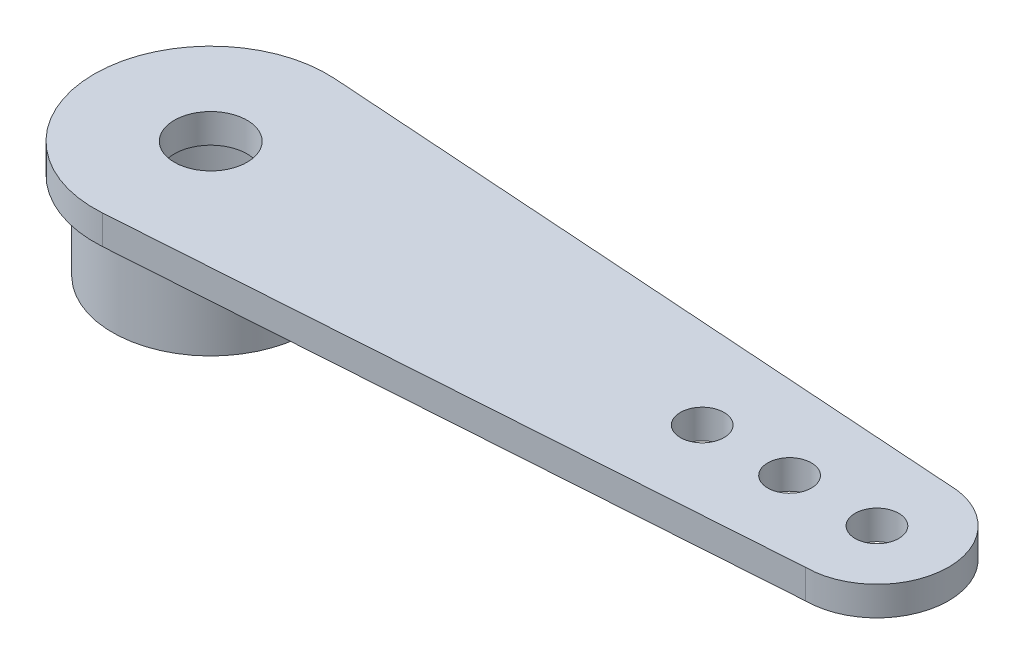
ISO-10303-21;
HEADER;
FILE_DESCRIPTION(('STEP AP214'),'2;1');
FILE_NAME('part.step','',(''),(''),'','','');
FILE_SCHEMA(('AUTOMOTIVE_DESIGN { 1 0 10303 214 1 1 1 1 }'));
ENDSEC;
DATA;
#1=APPLICATION_CONTEXT('core data for automotive mechanical design processes');
#2=APPLICATION_PROTOCOL_DEFINITION('international standard','automotive_design',2000,#1);
#3=PRODUCT_CONTEXT('',#1,'mechanical');
#4=PRODUCT('Part','Part','',(#3));
#5=PRODUCT_RELATED_PRODUCT_CATEGORY('part','',(#4));
#6=PRODUCT_DEFINITION_FORMATION('','',#4);
#7=PRODUCT_DEFINITION_CONTEXT('part definition',#1,'design');
#8=PRODUCT_DEFINITION('design','',#6,#7);
#9=PRODUCT_DEFINITION_SHAPE('','',#8);
#10=(LENGTH_UNIT() NAMED_UNIT(*) SI_UNIT(.MILLI.,.METRE.));
#11=(NAMED_UNIT(*) PLANE_ANGLE_UNIT() SI_UNIT($,.RADIAN.));
#12=(NAMED_UNIT(*) SI_UNIT($,.STERADIAN.) SOLID_ANGLE_UNIT());
#13=UNCERTAINTY_MEASURE_WITH_UNIT(LENGTH_MEASURE(1.E-05),#10,'distance_accuracy_value','');
#14=(GEOMETRIC_REPRESENTATION_CONTEXT(3) GLOBAL_UNCERTAINTY_ASSIGNED_CONTEXT((#13)) GLOBAL_UNIT_ASSIGNED_CONTEXT((#10,
#11,#12)) REPRESENTATION_CONTEXT('',''));
#15=CARTESIAN_POINT('',(0.,0.,0.));
#16=DIRECTION('',(0.,0.,1.));
#17=DIRECTION('',(1.,0.,0.));
#18=AXIS2_PLACEMENT_3D('',#15,#16,#17);
#19=CARTESIAN_POINT('',(0.,0.,0.));
#20=DIRECTION('',(0.,1.,0.));
#21=DIRECTION('',(0.,0.,1.));
#22=AXIS2_PLACEMENT_3D('',#19,#20,#21);
#23=PLANE('',#22);
#24=CARTESIAN_POINT('',(0.,0.,0.));
#25=DIRECTION('',(0.,1.,0.));
#26=DIRECTION('',(0.,0.,1.));
#27=AXIS2_PLACEMENT_3D('',#24,#25,#26);
#28=CIRCLE('',#27,3.429);
#29=CARTESIAN_POINT('',(0.,0.,-3.429));
#30=VERTEX_POINT('',#29);
#31=EDGE_CURVE('E39',#30,#30,#28,.T.);
#32=ORIENTED_EDGE('',*,*,#31,.F.);
#33=EDGE_LOOP('',(#32));
#34=FACE_BOUND('',#33,.T.);
#35=CARTESIAN_POINT('',(0.,0.,0.));
#36=DIRECTION('',(0.,1.,0.));
#37=DIRECTION('',(0.,0.,1.));
#38=AXIS2_PLACEMENT_3D('',#35,#36,#37);
#39=CIRCLE('',#38,2.794);
#40=CARTESIAN_POINT('',(0.,0.,-2.794));
#41=VERTEX_POINT('',#40);
#42=EDGE_CURVE('E140',#41,#41,#39,.T.);
#43=ORIENTED_EDGE('',*,*,#42,.T.);
#44=EDGE_LOOP('',(#43));
#45=FACE_BOUND('',#44,.T.);
#46=ADVANCED_FACE('F35',(#34,#45),#23,.F.);
#47=CARTESIAN_POINT('',(0.,3.048,0.));
#48=DIRECTION('',(0.,-1.,0.));
#49=DIRECTION('',(0.,0.,-1.));
#50=AXIS2_PLACEMENT_3D('',#47,#48,#49);
#51=CYLINDRICAL_SURFACE('',#50,3.429);
#52=CARTESIAN_POINT('',(0.,3.048,0.));
#53=DIRECTION('',(0.,1.,0.));
#54=DIRECTION('',(0.,0.,1.));
#55=AXIS2_PLACEMENT_3D('',#52,#53,#54);
#56=CIRCLE('',#55,3.429);
#57=CARTESIAN_POINT('',(0.,3.048,-3.429));
#58=VERTEX_POINT('',#57);
#59=EDGE_CURVE('E11',#58,#58,#56,.T.);
#60=CARTESIAN_POINT('',(0.,3.048,-3.429));
#61=CARTESIAN_POINT('',(0.,3.01625,-3.429));
#62=CARTESIAN_POINT('',(0.,2.9845,-3.429));
#63=CARTESIAN_POINT('',(0.,2.921,-3.429));
#64=CARTESIAN_POINT('',(0.,2.88925,-3.429));
#65=CARTESIAN_POINT('',(0.,2.82575,-3.429));
#66=CARTESIAN_POINT('',(0.,2.794,-3.429));
#67=CARTESIAN_POINT('',(0.,2.7305,-3.429));
#68=CARTESIAN_POINT('',(0.,2.69875,-3.429));
#69=CARTESIAN_POINT('',(0.,2.63525,-3.429));
#70=CARTESIAN_POINT('',(0.,2.6035,-3.429));
#71=CARTESIAN_POINT('',(0.,2.54,-3.429));
#72=CARTESIAN_POINT('',(0.,2.50825,-3.429));
#73=CARTESIAN_POINT('',(0.,2.44475,-3.429));
#74=CARTESIAN_POINT('',(0.,2.413,-3.429));
#75=CARTESIAN_POINT('',(0.,2.3495,-3.429));
#76=CARTESIAN_POINT('',(0.,2.31775,-3.429));
#77=CARTESIAN_POINT('',(0.,2.25425,-3.429));
#78=CARTESIAN_POINT('',(0.,2.2225,-3.429));
#79=CARTESIAN_POINT('',(0.,2.159,-3.429));
#80=CARTESIAN_POINT('',(0.,2.12725,-3.429));
#81=CARTESIAN_POINT('',(0.,2.06375,-3.429));
#82=CARTESIAN_POINT('',(0.,2.032,-3.429));
#83=CARTESIAN_POINT('',(0.,1.9685,-3.429));
#84=CARTESIAN_POINT('',(0.,1.93675,-3.429));
#85=CARTESIAN_POINT('',(0.,1.87325,-3.429));
#86=CARTESIAN_POINT('',(0.,1.8415,-3.429));
#87=CARTESIAN_POINT('',(0.,1.778,-3.429));
#88=CARTESIAN_POINT('',(0.,1.74625,-3.429));
#89=CARTESIAN_POINT('',(0.,1.68275,-3.429));
#90=CARTESIAN_POINT('',(0.,1.651,-3.429));
#91=CARTESIAN_POINT('',(0.,1.5875,-3.429));
#92=CARTESIAN_POINT('',(0.,1.55575,-3.429));
#93=CARTESIAN_POINT('',(0.,1.49225,-3.429));
#94=CARTESIAN_POINT('',(0.,1.4605,-3.429));
#95=CARTESIAN_POINT('',(0.,1.397,-3.429));
#96=CARTESIAN_POINT('',(0.,1.36525,-3.429));
#97=CARTESIAN_POINT('',(0.,1.30175,-3.429));
#98=CARTESIAN_POINT('',(0.,1.27,-3.429));
#99=CARTESIAN_POINT('',(0.,1.2065,-3.429));
#100=CARTESIAN_POINT('',(0.,1.17475,-3.429));
#101=CARTESIAN_POINT('',(0.,1.11125,-3.429));
#102=CARTESIAN_POINT('',(0.,1.0795,-3.429));
#103=CARTESIAN_POINT('',(0.,1.016,-3.429));
#104=CARTESIAN_POINT('',(0.,0.98425,-3.429));
#105=CARTESIAN_POINT('',(0.,0.92075,-3.429));
#106=CARTESIAN_POINT('',(0.,0.889,-3.429));
#107=CARTESIAN_POINT('',(0.,0.8255,-3.429));
#108=CARTESIAN_POINT('',(0.,0.79375,-3.429));
#109=CARTESIAN_POINT('',(0.,0.73025,-3.429));
#110=CARTESIAN_POINT('',(0.,0.6985,-3.429));
#111=CARTESIAN_POINT('',(0.,0.635,-3.429));
#112=CARTESIAN_POINT('',(0.,0.60325,-3.429));
#113=CARTESIAN_POINT('',(0.,0.53975,-3.429));
#114=CARTESIAN_POINT('',(0.,0.508,-3.429));
#115=CARTESIAN_POINT('',(0.,0.4445,-3.429));
#116=CARTESIAN_POINT('',(0.,0.41275,-3.429));
#117=CARTESIAN_POINT('',(0.,0.34925,-3.429));
#118=CARTESIAN_POINT('',(0.,0.3175,-3.429));
#119=CARTESIAN_POINT('',(0.,0.254,-3.429));
#120=CARTESIAN_POINT('',(0.,0.22225,-3.429));
#121=CARTESIAN_POINT('',(0.,0.15875,-3.429));
#122=CARTESIAN_POINT('',(0.,0.127,-3.429));
#123=CARTESIAN_POINT('',(0.,0.0634999999999999,-3.429));
#124=CARTESIAN_POINT('',(0.,0.03175,-3.429));
#125=CARTESIAN_POINT('',(0.,0.,-3.429));
#126=B_SPLINE_CURVE_WITH_KNOTS('',3,(#60,#61,#62,#63,#64,#65,#66,#67,#68,#69,#70,#71,#72,#73,
#74,#75,#76,#77,#78,#79,#80,#81,#82,#83,#84,#85,#86,#87,#88,#89,#90,#91,#92,#93,#94,#95,#96,#97,
#98,#99,#100,#101,#102,#103,#104,#105,#106,#107,#108,#109,#110,#111,#112,#113,#114,#115,#116,
#117,#118,#119,#120,#121,#122,#123,#124,#125),.UNSPECIFIED.,.F.,.F.,(4,2,2,2,2,2,2,2,2,2,2,2,2,
2,2,2,2,2,2,2,2,2,2,2,2,2,2,2,2,2,2,2,4),(0.,0.0952500000000003,0.1905,0.28575,0.381,0.47625,
0.5715,0.66675,0.762,0.85725,0.9525,1.04775,1.143,1.23825,1.3335,1.42875,1.524,1.61925,1.7145,
1.80975,1.905,2.00025,2.0955,2.19075,2.286,2.38125,2.4765,2.57175,2.667,2.76225,2.8575,2.95275,
3.048),.UNSPECIFIED.);
#127=EDGE_CURVE('BSEAM37',#58,#30,#126,.T.);
#128=ORIENTED_EDGE('',*,*,#59,.F.);
#129=ORIENTED_EDGE('',*,*,#31,.T.);
#130=ORIENTED_EDGE('',*,*,#127,.T.);
#131=ORIENTED_EDGE('',*,*,#127,.F.);
#132=EDGE_LOOP('',(#128,#130,#129,#131));
#133=FACE_BOUND('',#132,.T.);
#134=ADVANCED_FACE('F37',(#133),#51,.T.);
#135=CARTESIAN_POINT('',(0.,3.048,0.));
#136=DIRECTION('',(0.,-1.,0.));
#137=DIRECTION('',(0.,0.,-1.));
#138=AXIS2_PLACEMENT_3D('',#135,#136,#137);
#139=CYLINDRICAL_SURFACE('',#138,2.794);
#140=CARTESIAN_POINT('',(0.,3.048,0.));
#141=DIRECTION('',(0.,1.,0.));
#142=DIRECTION('',(0.,0.,1.));
#143=AXIS2_PLACEMENT_3D('',#140,#141,#142);
#144=CIRCLE('',#143,2.794);
#145=CARTESIAN_POINT('',(0.,3.048,-2.794));
#146=VERTEX_POINT('',#145);
#147=EDGE_CURVE('E137',#146,#146,#144,.T.);
#148=CARTESIAN_POINT('',(0.,3.048,-2.794));
#149=CARTESIAN_POINT('',(0.,3.01625,-2.794));
#150=CARTESIAN_POINT('',(0.,2.9845,-2.794));
#151=CARTESIAN_POINT('',(0.,2.921,-2.794));
#152=CARTESIAN_POINT('',(0.,2.88925,-2.794));
#153=CARTESIAN_POINT('',(0.,2.82575,-2.794));
#154=CARTESIAN_POINT('',(0.,2.794,-2.794));
#155=CARTESIAN_POINT('',(0.,2.7305,-2.794));
#156=CARTESIAN_POINT('',(0.,2.69875,-2.794));
#157=CARTESIAN_POINT('',(0.,2.63525,-2.794));
#158=CARTESIAN_POINT('',(0.,2.6035,-2.794));
#159=CARTESIAN_POINT('',(0.,2.54,-2.794));
#160=CARTESIAN_POINT('',(0.,2.50825,-2.794));
#161=CARTESIAN_POINT('',(0.,2.44475,-2.794));
#162=CARTESIAN_POINT('',(0.,2.413,-2.794));
#163=CARTESIAN_POINT('',(0.,2.3495,-2.794));
#164=CARTESIAN_POINT('',(0.,2.31775,-2.794));
#165=CARTESIAN_POINT('',(0.,2.25425,-2.794));
#166=CARTESIAN_POINT('',(0.,2.2225,-2.794));
#167=CARTESIAN_POINT('',(0.,2.159,-2.794));
#168=CARTESIAN_POINT('',(0.,2.12725,-2.794));
#169=CARTESIAN_POINT('',(0.,2.06375,-2.794));
#170=CARTESIAN_POINT('',(0.,2.032,-2.794));
#171=CARTESIAN_POINT('',(0.,1.9685,-2.794));
#172=CARTESIAN_POINT('',(0.,1.93675,-2.794));
#173=CARTESIAN_POINT('',(0.,1.87325,-2.794));
#174=CARTESIAN_POINT('',(0.,1.8415,-2.794));
#175=CARTESIAN_POINT('',(0.,1.778,-2.794));
#176=CARTESIAN_POINT('',(0.,1.74625,-2.794));
#177=CARTESIAN_POINT('',(0.,1.68275,-2.794));
#178=CARTESIAN_POINT('',(0.,1.651,-2.794));
#179=CARTESIAN_POINT('',(0.,1.5875,-2.794));
#180=CARTESIAN_POINT('',(0.,1.55575,-2.794));
#181=CARTESIAN_POINT('',(0.,1.49225,-2.794));
#182=CARTESIAN_POINT('',(0.,1.4605,-2.794));
#183=CARTESIAN_POINT('',(0.,1.397,-2.794));
#184=CARTESIAN_POINT('',(0.,1.36525,-2.794));
#185=CARTESIAN_POINT('',(0.,1.30175,-2.794));
#186=CARTESIAN_POINT('',(0.,1.27,-2.794));
#187=CARTESIAN_POINT('',(0.,1.2065,-2.794));
#188=CARTESIAN_POINT('',(0.,1.17475,-2.794));
#189=CARTESIAN_POINT('',(0.,1.11125,-2.794));
#190=CARTESIAN_POINT('',(0.,1.0795,-2.794));
#191=CARTESIAN_POINT('',(0.,1.016,-2.794));
#192=CARTESIAN_POINT('',(0.,0.98425,-2.794));
#193=CARTESIAN_POINT('',(0.,0.92075,-2.794));
#194=CARTESIAN_POINT('',(0.,0.889,-2.794));
#195=CARTESIAN_POINT('',(0.,0.8255,-2.794));
#196=CARTESIAN_POINT('',(0.,0.79375,-2.794));
#197=CARTESIAN_POINT('',(0.,0.73025,-2.794));
#198=CARTESIAN_POINT('',(0.,0.6985,-2.794));
#199=CARTESIAN_POINT('',(0.,0.635,-2.794));
#200=CARTESIAN_POINT('',(0.,0.60325,-2.794));
#201=CARTESIAN_POINT('',(0.,0.53975,-2.794));
#202=CARTESIAN_POINT('',(0.,0.508,-2.794));
#203=CARTESIAN_POINT('',(0.,0.4445,-2.794));
#204=CARTESIAN_POINT('',(0.,0.41275,-2.794));
#205=CARTESIAN_POINT('',(0.,0.34925,-2.794));
#206=CARTESIAN_POINT('',(0.,0.3175,-2.794));
#207=CARTESIAN_POINT('',(0.,0.254,-2.794));
#208=CARTESIAN_POINT('',(0.,0.22225,-2.794));
#209=CARTESIAN_POINT('',(0.,0.15875,-2.794));
#210=CARTESIAN_POINT('',(0.,0.127,-2.794));
#211=CARTESIAN_POINT('',(0.,0.0634999999999999,-2.794));
#212=CARTESIAN_POINT('',(0.,0.03175,-2.794));
#213=CARTESIAN_POINT('',(0.,0.,-2.794));
#214=B_SPLINE_CURVE_WITH_KNOTS('',3,(#148,#149,#150,#151,#152,#153,#154,#155,#156,#157,#158,
#159,#160,#161,#162,#163,#164,#165,#166,#167,#168,#169,#170,#171,#172,#173,#174,#175,#176,#177,
#178,#179,#180,#181,#182,#183,#184,#185,#186,#187,#188,#189,#190,#191,#192,#193,#194,#195,#196,
#197,#198,#199,#200,#201,#202,#203,#204,#205,#206,#207,#208,#209,#210,#211,#212,#213),
.UNSPECIFIED.,.F.,.F.,(4,2,2,2,2,2,2,2,2,2,2,2,2,2,2,2,2,2,2,2,2,2,2,2,2,2,2,2,2,2,2,2,4),(0.,
0.0952499999999998,0.1905,0.28575,0.381,0.47625,0.5715,0.66675,0.762,0.85725,0.9525,1.04775,
1.143,1.23825,1.3335,1.42875,1.524,1.61925,1.7145,1.80975,1.905,2.00025,2.0955,2.19075,2.286,
2.38125,2.4765,2.57175,2.667,2.76225,2.8575,2.95275,3.048),.UNSPECIFIED.);
#215=EDGE_CURVE('BSEAM152',#146,#41,#214,.T.);
#216=ORIENTED_EDGE('',*,*,#147,.T.);
#217=ORIENTED_EDGE('',*,*,#42,.F.);
#218=ORIENTED_EDGE('',*,*,#215,.T.);
#219=ORIENTED_EDGE('',*,*,#215,.F.);
#220=EDGE_LOOP('',(#216,#218,#217,#219));
#221=FACE_BOUND('',#220,.T.);
#222=ADVANCED_FACE('F152',(#221),#139,.F.);
#223=CARTESIAN_POINT('',(0.,3.048,0.));
#224=DIRECTION('',(0.,1.,0.));
#225=DIRECTION('',(0.,0.,1.));
#226=AXIS2_PLACEMENT_3D('',#223,#224,#225);
#227=PLANE('',#226);
#228=CARTESIAN_POINT('',(0.,3.048,0.));
#229=DIRECTION('',(0.,1.,0.));
#230=DIRECTION('',(0.,0.,1.));
#231=AXIS2_PLACEMENT_3D('',#228,#229,#230);
#232=CIRCLE('',#231,1.27);
#233=CARTESIAN_POINT('',(0.,3.048,1.27));
#234=VERTEX_POINT('',#233);
#235=EDGE_CURVE('E131',#234,#234,#232,.T.);
#236=ORIENTED_EDGE('',*,*,#235,.T.);
#237=EDGE_LOOP('',(#236));
#238=FACE_BOUND('',#237,.T.);
#239=ORIENTED_EDGE('',*,*,#147,.F.);
#240=EDGE_LOOP('',(#239));
#241=FACE_BOUND('',#240,.T.);
#242=ADVANCED_FACE('F157',(#238,#241),#227,.F.);
#243=CARTESIAN_POINT('',(0.275010075550156,4.064,-4.05468438455398));
#244=DIRECTION('',(-0.0676698020546643,0.,0.997707771789858));
#245=DIRECTION('',(0.997707771789858,0.,0.0676698020546643));
#246=AXIS2_PLACEMENT_3D('',#243,#244,#245);
#247=PLANE('',#246);
#248=DIRECTION('',(-0.997707771789858,0.,-0.0676698020546643));
#249=VECTOR('',#248,1.);
#250=CARTESIAN_POINT('',(0.275010075550156,3.048,-4.05468438455398));
#251=LINE('',#250,#249);
#252=CARTESIAN_POINT('',(23.241,3.048,-2.49700984685952));
#253=VERTEX_POINT('',#252);
#254=CARTESIAN_POINT('',(0.275010075550156,3.048,-4.05468438455398));
#255=VERTEX_POINT('',#254);
#256=EDGE_CURVE('E115',#253,#255,#251,.T.);
#257=ORIENTED_EDGE('',*,*,#256,.T.);
#258=DIRECTION('',(0.,-1.,0.));
#259=VECTOR('',#258,1.);
#260=CARTESIAN_POINT('',(0.275010075550156,4.064,-4.05468438455398));
#261=LINE('',#260,#259);
#262=CARTESIAN_POINT('',(0.275010075550156,4.064,-4.05468438455398));
#263=VERTEX_POINT('',#262);
#264=EDGE_CURVE('E95',#263,#255,#261,.T.);
#265=ORIENTED_EDGE('',*,*,#264,.F.);
#266=DIRECTION('',(-0.997707771789858,0.,-0.0676698020546643));
#267=VECTOR('',#266,1.);
#268=CARTESIAN_POINT('',(0.275010075550156,4.064,-4.05468438455398));
#269=LINE('',#268,#267);
#270=CARTESIAN_POINT('',(23.241,4.064,-2.49700984685952));
#271=VERTEX_POINT('',#270);
#272=EDGE_CURVE('E85',#271,#263,#269,.T.);
#273=ORIENTED_EDGE('',*,*,#272,.F.);
#274=DIRECTION('',(0.,-1.,0.));
#275=VECTOR('',#274,1.);
#276=CARTESIAN_POINT('',(23.241,4.064,-2.49700984685952));
#277=LINE('',#276,#275);
#278=EDGE_CURVE('E114',#271,#253,#277,.T.);
#279=ORIENTED_EDGE('',*,*,#278,.T.);
#280=EDGE_LOOP('',(#257,#265,#273,#279));
#281=FACE_BOUND('',#280,.T.);
#282=ADVANCED_FACE('F159',(#281),#247,.F.);
#283=CARTESIAN_POINT('',(0.,4.064,0.));
#284=DIRECTION('',(0.,-1.,0.));
#285=DIRECTION('',(0.,0.,-1.));
#286=AXIS2_PLACEMENT_3D('',#283,#284,#285);
#287=CYLINDRICAL_SURFACE('',#286,4.064);
#288=CARTESIAN_POINT('',(0.,3.048,0.));
#289=DIRECTION('',(0.,1.,0.));
#290=DIRECTION('',(0.,0.,1.));
#291=AXIS2_PLACEMENT_3D('',#288,#289,#290);
#292=CIRCLE('',#291,4.064);
#293=CARTESIAN_POINT('',(0.275010075550156,3.048,4.05468438455398));
#294=VERTEX_POINT('',#293);
#295=EDGE_CURVE('E91',#255,#294,#292,.T.);
#296=ORIENTED_EDGE('',*,*,#295,.T.);
#297=DIRECTION('',(0.,-1.,0.));
#298=VECTOR('',#297,1.);
#299=CARTESIAN_POINT('',(0.275010075550156,4.064,4.05468438455398));
#300=LINE('',#299,#298);
#301=CARTESIAN_POINT('',(0.275010075550156,4.064,4.05468438455398));
#302=VERTEX_POINT('',#301);
#303=EDGE_CURVE('E89',#302,#294,#300,.T.);
#304=ORIENTED_EDGE('',*,*,#303,.F.);
#305=CARTESIAN_POINT('',(0.,4.064,0.));
#306=DIRECTION('',(0.,1.,0.));
#307=DIRECTION('',(0.,0.,1.));
#308=AXIS2_PLACEMENT_3D('',#305,#306,#307);
#309=CIRCLE('',#308,4.064);
#310=EDGE_CURVE('E79',#263,#302,#309,.T.);
#311=ORIENTED_EDGE('',*,*,#310,.F.);
#312=ORIENTED_EDGE('',*,*,#264,.T.);
#313=EDGE_LOOP('',(#296,#304,#311,#312));
#314=FACE_BOUND('',#313,.T.);
#315=ADVANCED_FACE('F90',(#314),#287,.T.);
#316=CARTESIAN_POINT('',(0.275010075550156,4.064,4.05468438455398));
#317=DIRECTION('',(0.0676698020546643,0.,0.997707771789858));
#318=DIRECTION('',(0.997707771789858,0.,-0.0676698020546643));
#319=AXIS2_PLACEMENT_3D('',#316,#317,#318);
#320=PLANE('',#319);
#321=DIRECTION('',(-0.997707771789858,0.,0.0676698020546643));
#322=VECTOR('',#321,1.);
#323=CARTESIAN_POINT('',(0.275010075550156,3.048,4.05468438455398));
#324=LINE('',#323,#322);
#325=CARTESIAN_POINT('',(23.241,3.048,2.49700984685952));
#326=VERTEX_POINT('',#325);
#327=EDGE_CURVE('E119',#326,#294,#324,.T.);
#328=ORIENTED_EDGE('',*,*,#327,.F.);
#329=DIRECTION('',(0.,-1.,0.));
#330=VECTOR('',#329,1.);
#331=CARTESIAN_POINT('',(23.241,4.064,2.49700984685952));
#332=LINE('',#331,#330);
#333=CARTESIAN_POINT('',(23.241,4.064,2.49700984685952));
#334=VERTEX_POINT('',#333);
#335=EDGE_CURVE('E68',#334,#326,#332,.T.);
#336=ORIENTED_EDGE('',*,*,#335,.F.);
#337=DIRECTION('',(-0.997707771789858,0.,0.0676698020546643));
#338=VECTOR('',#337,1.);
#339=CARTESIAN_POINT('',(0.275010075550156,4.064,4.05468438455398));
#340=LINE('',#339,#338);
#341=EDGE_CURVE('E83',#334,#302,#340,.T.);
#342=ORIENTED_EDGE('',*,*,#341,.T.);
#343=ORIENTED_EDGE('',*,*,#303,.T.);
#344=EDGE_LOOP('',(#328,#336,#342,#343));
#345=FACE_BOUND('',#344,.T.);
#346=ADVANCED_FACE('F97',(#345),#320,.T.);
#347=CARTESIAN_POINT('',(23.241,4.064,0.));
#348=DIRECTION('',(0.,-1.,0.));
#349=DIRECTION('',(0.,0.,-1.));
#350=AXIS2_PLACEMENT_3D('',#347,#348,#349);
#351=CYLINDRICAL_SURFACE('',#350,0.762000000000003);
#352=CARTESIAN_POINT('',(23.241,4.064,0.));
#353=DIRECTION('',(0.,1.,0.));
#354=DIRECTION('',(0.,0.,1.));
#355=AXIS2_PLACEMENT_3D('',#352,#353,#354);
#356=CIRCLE('',#355,0.762000000000003);
#357=CARTESIAN_POINT('',(23.241,4.064,0.762000000000003));
#358=VERTEX_POINT('',#357);
#359=EDGE_CURVE('E108',#358,#358,#356,.T.);
#360=ORIENTED_EDGE('',*,*,#359,.T.);
#361=EDGE_LOOP('',(#360));
#362=FACE_BOUND('',#361,.T.);
#363=CARTESIAN_POINT('',(23.241,3.048,0.));
#364=DIRECTION('',(0.,1.,0.));
#365=DIRECTION('',(0.,0.,1.));
#366=AXIS2_PLACEMENT_3D('',#363,#364,#365);
#367=CIRCLE('',#366,0.762000000000003);
#368=CARTESIAN_POINT('',(23.241,3.048,0.762000000000003));
#369=VERTEX_POINT('',#368);
#370=EDGE_CURVE('E128',#369,#369,#367,.T.);
#371=ORIENTED_EDGE('',*,*,#370,.F.);
#372=EDGE_LOOP('',(#371));
#373=FACE_BOUND('',#372,.T.);
#374=ADVANCED_FACE('F167',(#362,#373),#351,.F.);
#375=CARTESIAN_POINT('',(17.145,4.064,0.));
#376=DIRECTION('',(0.,-1.,0.));
#377=DIRECTION('',(0.,0.,-1.));
#378=AXIS2_PLACEMENT_3D('',#375,#376,#377);
#379=CYLINDRICAL_SURFACE('',#378,0.762000000000003);
#380=CARTESIAN_POINT('',(17.145,4.064,0.));
#381=DIRECTION('',(0.,1.,0.));
#382=DIRECTION('',(0.,0.,1.));
#383=AXIS2_PLACEMENT_3D('',#380,#381,#382);
#384=CIRCLE('',#383,0.762000000000003);
#385=CARTESIAN_POINT('',(17.145,4.064,0.762000000000003));
#386=VERTEX_POINT('',#385);
#387=EDGE_CURVE('E105',#386,#386,#384,.T.);
#388=ORIENTED_EDGE('',*,*,#387,.T.);
#389=EDGE_LOOP('',(#388));
#390=FACE_BOUND('',#389,.T.);
#391=CARTESIAN_POINT('',(17.145,3.048,0.));
#392=DIRECTION('',(0.,1.,0.));
#393=DIRECTION('',(0.,0.,1.));
#394=AXIS2_PLACEMENT_3D('',#391,#392,#393);
#395=CIRCLE('',#394,0.762000000000003);
#396=CARTESIAN_POINT('',(17.145,3.048,0.762000000000003));
#397=VERTEX_POINT('',#396);
#398=EDGE_CURVE('E125',#397,#397,#395,.T.);
#399=ORIENTED_EDGE('',*,*,#398,.F.);
#400=EDGE_LOOP('',(#399));
#401=FACE_BOUND('',#400,.T.);
#402=ADVANCED_FACE('F175',(#390,#401),#379,.F.);
#403=CARTESIAN_POINT('',(20.193,4.064,0.));
#404=DIRECTION('',(0.,-1.,0.));
#405=DIRECTION('',(0.,0.,-1.));
#406=AXIS2_PLACEMENT_3D('',#403,#404,#405);
#407=CYLINDRICAL_SURFACE('',#406,0.762000000000003);
#408=CARTESIAN_POINT('',(20.193,4.064,0.));
#409=DIRECTION('',(0.,1.,0.));
#410=DIRECTION('',(0.,0.,1.));
#411=AXIS2_PLACEMENT_3D('',#408,#409,#410);
#412=CIRCLE('',#411,0.762000000000003);
#413=CARTESIAN_POINT('',(20.193,4.064,0.762000000000003));
#414=VERTEX_POINT('',#413);
#415=EDGE_CURVE('E99',#414,#414,#412,.T.);
#416=ORIENTED_EDGE('',*,*,#415,.T.);
#417=EDGE_LOOP('',(#416));
#418=FACE_BOUND('',#417,.T.);
#419=CARTESIAN_POINT('',(20.193,3.048,0.));
#420=DIRECTION('',(0.,1.,0.));
#421=DIRECTION('',(0.,0.,1.));
#422=AXIS2_PLACEMENT_3D('',#419,#420,#421);
#423=CIRCLE('',#422,0.762000000000003);
#424=CARTESIAN_POINT('',(20.193,3.048,0.762000000000003));
#425=VERTEX_POINT('',#424);
#426=EDGE_CURVE('E122',#425,#425,#423,.T.);
#427=ORIENTED_EDGE('',*,*,#426,.F.);
#428=EDGE_LOOP('',(#427));
#429=FACE_BOUND('',#428,.T.);
#430=ADVANCED_FACE('F172',(#418,#429),#407,.F.);
#431=CARTESIAN_POINT('',(23.241,4.064,0.));
#432=DIRECTION('',(0.,-1.,0.));
#433=DIRECTION('',(0.,0.,-1.));
#434=AXIS2_PLACEMENT_3D('',#431,#432,#433);
#435=CYLINDRICAL_SURFACE('',#434,2.49700984685952);
#436=CARTESIAN_POINT('',(23.241,3.048,0.));
#437=DIRECTION('',(0.,1.,0.));
#438=DIRECTION('',(0.,0.,1.));
#439=AXIS2_PLACEMENT_3D('',#436,#437,#438);
#440=CIRCLE('',#439,2.49700984685952);
#441=EDGE_CURVE('E71',#326,#253,#440,.T.);
#442=ORIENTED_EDGE('',*,*,#441,.T.);
#443=ORIENTED_EDGE('',*,*,#278,.F.);
#444=CARTESIAN_POINT('',(23.241,4.064,0.));
#445=DIRECTION('',(0.,1.,0.));
#446=DIRECTION('',(0.,0.,1.));
#447=AXIS2_PLACEMENT_3D('',#444,#445,#446);
#448=CIRCLE('',#447,2.49700984685952);
#449=EDGE_CURVE('E52',#334,#271,#448,.T.);
#450=ORIENTED_EDGE('',*,*,#449,.F.);
#451=ORIENTED_EDGE('',*,*,#335,.T.);
#452=EDGE_LOOP('',(#442,#443,#450,#451));
#453=FACE_BOUND('',#452,.T.);
#454=ADVANCED_FACE('F168',(#453),#435,.T.);
#455=CARTESIAN_POINT('',(0.,4.064,0.));
#456=DIRECTION('',(0.,-1.,0.));
#457=DIRECTION('',(0.,0.,-1.));
#458=AXIS2_PLACEMENT_3D('',#455,#456,#457);
#459=CYLINDRICAL_SURFACE('',#458,1.27);
#460=CARTESIAN_POINT('',(0.,4.064,0.));
#461=DIRECTION('',(0.,1.,0.));
#462=DIRECTION('',(0.,0.,1.));
#463=AXIS2_PLACEMENT_3D('',#460,#461,#462);
#464=CIRCLE('',#463,1.27);
#465=CARTESIAN_POINT('',(0.,4.064,1.27));
#466=VERTEX_POINT('',#465);
#467=EDGE_CURVE('E111',#466,#466,#464,.T.);
#468=ORIENTED_EDGE('',*,*,#467,.T.);
#469=EDGE_LOOP('',(#468));
#470=FACE_BOUND('',#469,.T.);
#471=ORIENTED_EDGE('',*,*,#235,.F.);
#472=EDGE_LOOP('',(#471));
#473=FACE_BOUND('',#472,.T.);
#474=ADVANCED_FACE('F171',(#470,#473),#459,.F.);
#475=CARTESIAN_POINT('',(0.,4.064,0.));
#476=DIRECTION('',(0.,1.,0.));
#477=DIRECTION('',(0.,0.,1.));
#478=AXIS2_PLACEMENT_3D('',#475,#476,#477);
#479=PLANE('',#478);
#480=ORIENTED_EDGE('',*,*,#272,.T.);
#481=ORIENTED_EDGE('',*,*,#310,.T.);
#482=ORIENTED_EDGE('',*,*,#341,.F.);
#483=ORIENTED_EDGE('',*,*,#449,.T.);
#484=EDGE_LOOP('',(#480,#481,#482,#483));
#485=FACE_BOUND('',#484,.T.);
#486=ORIENTED_EDGE('',*,*,#415,.F.);
#487=EDGE_LOOP('',(#486));
#488=FACE_BOUND('',#487,.T.);
#489=ORIENTED_EDGE('',*,*,#387,.F.);
#490=EDGE_LOOP('',(#489));
#491=FACE_BOUND('',#490,.T.);
#492=ORIENTED_EDGE('',*,*,#359,.F.);
#493=EDGE_LOOP('',(#492));
#494=FACE_BOUND('',#493,.T.);
#495=ORIENTED_EDGE('',*,*,#467,.F.);
#496=EDGE_LOOP('',(#495));
#497=FACE_BOUND('',#496,.T.);
#498=ADVANCED_FACE('F80',(#485,#488,#491,#494,#497),#479,.T.);
#499=ORIENTED_EDGE('',*,*,#59,.T.);
#500=EDGE_LOOP('',(#499));
#501=FACE_BOUND('',#500,.T.);
#502=ORIENTED_EDGE('',*,*,#256,.F.);
#503=ORIENTED_EDGE('',*,*,#441,.F.);
#504=ORIENTED_EDGE('',*,*,#327,.T.);
#505=ORIENTED_EDGE('',*,*,#295,.F.);
#506=EDGE_LOOP('',(#502,#503,#504,#505));
#507=FACE_BOUND('',#506,.T.);
#508=ORIENTED_EDGE('',*,*,#426,.T.);
#509=EDGE_LOOP('',(#508));
#510=FACE_BOUND('',#509,.T.);
#511=ORIENTED_EDGE('',*,*,#398,.T.);
#512=EDGE_LOOP('',(#511));
#513=FACE_BOUND('',#512,.T.);
#514=ORIENTED_EDGE('',*,*,#370,.T.);
#515=EDGE_LOOP('',(#514));
#516=FACE_BOUND('',#515,.T.);
#517=ADVANCED_FACE('F186',(#501,#507,#510,#513,#516),#227,.F.);
#518=CLOSED_SHELL('',(#46,#134,#222,#242,#282,#315,#346,#374,#402,#430,#454,#474,#498,#517));
#519=MANIFOLD_SOLID_BREP('B2',#518);
#520=ADVANCED_BREP_SHAPE_REPRESENTATION('',(#18,#519),#14);
#521=SHAPE_DEFINITION_REPRESENTATION(#9,#520);
ENDSEC;
END-ISO-10303-21;
